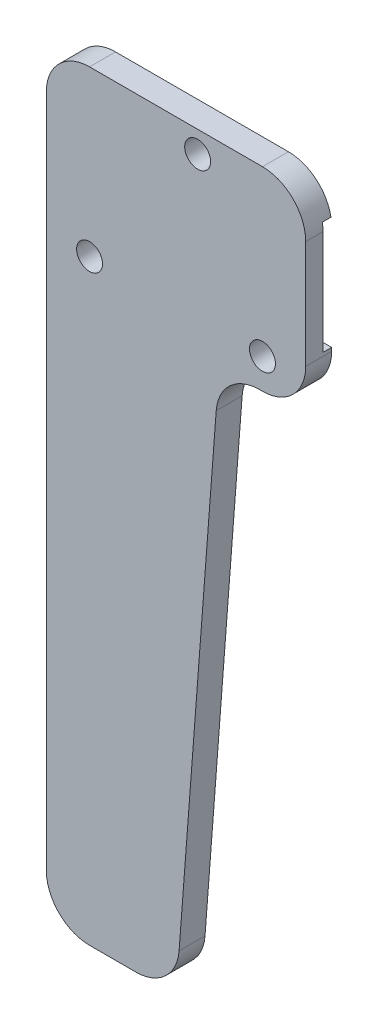
ISO-10303-21;
HEADER;
FILE_DESCRIPTION(('STEP AP214'),'2;1');
FILE_NAME('part.step','',(''),(''),'','','');
FILE_SCHEMA(('AUTOMOTIVE_DESIGN { 1 0 10303 214 1 1 1 1 }'));
ENDSEC;
DATA;
#1=APPLICATION_CONTEXT('core data for automotive mechanical design processes');
#2=APPLICATION_PROTOCOL_DEFINITION('international standard','automotive_design',2000,#1);
#3=PRODUCT_CONTEXT('',#1,'mechanical');
#4=PRODUCT('Part','Part','',(#3));
#5=PRODUCT_RELATED_PRODUCT_CATEGORY('part','',(#4));
#6=PRODUCT_DEFINITION_FORMATION('','',#4);
#7=PRODUCT_DEFINITION_CONTEXT('part definition',#1,'design');
#8=PRODUCT_DEFINITION('design','',#6,#7);
#9=PRODUCT_DEFINITION_SHAPE('','',#8);
#10=(LENGTH_UNIT() NAMED_UNIT(*) SI_UNIT(.MILLI.,.METRE.));
#11=(NAMED_UNIT(*) PLANE_ANGLE_UNIT() SI_UNIT($,.RADIAN.));
#12=(NAMED_UNIT(*) SI_UNIT($,.STERADIAN.) SOLID_ANGLE_UNIT());
#13=UNCERTAINTY_MEASURE_WITH_UNIT(LENGTH_MEASURE(1.E-05),#10,'distance_accuracy_value','');
#14=(GEOMETRIC_REPRESENTATION_CONTEXT(3) GLOBAL_UNCERTAINTY_ASSIGNED_CONTEXT((#13)) GLOBAL_UNIT_ASSIGNED_CONTEXT((#10,
#11,#12)) REPRESENTATION_CONTEXT('',''));
#15=CARTESIAN_POINT('',(0.,0.,0.));
#16=DIRECTION('',(0.,0.,1.));
#17=DIRECTION('',(1.,0.,0.));
#18=AXIS2_PLACEMENT_3D('',#15,#16,#17);
#19=CARTESIAN_POINT('',(5.00000000000001,-83.,-3.));
#20=DIRECTION('',(0.,0.,1.));
#21=DIRECTION('',(1.,0.,0.));
#22=AXIS2_PLACEMENT_3D('',#19,#20,#21);
#23=PLANE('',#22);
#24=CARTESIAN_POINT('',(17.5,-2.5,-3.));
#25=DIRECTION('',(0.,0.,1.));
#26=DIRECTION('',(1.,0.,0.));
#27=AXIS2_PLACEMENT_3D('',#24,#25,#26);
#28=CIRCLE('',#27,1.5);
#29=CARTESIAN_POINT('',(19.,-2.5,-3.));
#30=VERTEX_POINT('',#29);
#31=EDGE_CURVE('E186',#30,#30,#28,.T.);
#32=ORIENTED_EDGE('',*,*,#31,.T.);
#33=EDGE_LOOP('',(#32));
#34=FACE_BOUND('',#33,.T.);
#35=CARTESIAN_POINT('',(25.,-5.,-3.));
#36=DIRECTION('',(0.,0.,1.));
#37=DIRECTION('',(-1.,0.,0.));
#38=AXIS2_PLACEMENT_3D('',#35,#36,#37);
#39=CIRCLE('',#38,5.);
#40=CARTESIAN_POINT('',(29.9183330509432,-4.1,-3.));
#41=VERTEX_POINT('',#40);
#42=CARTESIAN_POINT('',(25.,0.,-3.));
#43=VERTEX_POINT('',#42);
#44=EDGE_CURVE('E144',#41,#43,#39,.T.);
#45=ORIENTED_EDGE('',*,*,#44,.F.);
#46=DIRECTION('',(-1.,0.,0.));
#47=VECTOR('',#46,1.);
#48=CARTESIAN_POINT('',(5.00000000000001,-4.09999999999999,-3.));
#49=LINE('',#48,#47);
#50=CARTESIAN_POINT('',(0.0816669490568273,-4.1,-3.));
#51=VERTEX_POINT('',#50);
#52=EDGE_CURVE('E11',#41,#51,#49,.T.);
#53=ORIENTED_EDGE('',*,*,#52,.T.);
#54=CARTESIAN_POINT('',(5.,-5.,-3.));
#55=DIRECTION('',(0.,0.,1.));
#56=DIRECTION('',(-1.,0.,0.));
#57=AXIS2_PLACEMENT_3D('',#54,#55,#56);
#58=CIRCLE('',#57,5.);
#59=CARTESIAN_POINT('',(5.00000000000004,0.,-3.));
#60=VERTEX_POINT('',#59);
#61=EDGE_CURVE('E172',#60,#51,#58,.T.);
#62=ORIENTED_EDGE('',*,*,#61,.F.);
#63=DIRECTION('',(-1.,0.,0.));
#64=VECTOR('',#63,1.);
#65=CARTESIAN_POINT('',(5.00000000000004,0.,-3.));
#66=LINE('',#65,#64);
#67=EDGE_CURVE('E157',#43,#60,#66,.T.);
#68=ORIENTED_EDGE('',*,*,#67,.F.);
#69=EDGE_LOOP('',(#45,#53,#62,#68));
#70=FACE_BOUND('',#69,.T.);
#71=ADVANCED_FACE('F44',(#34,#70),#23,.F.);
#72=CARTESIAN_POINT('',(5.00000000000001,-83.,-3.));
#73=DIRECTION('',(0.,0.,1.));
#74=DIRECTION('',(1.,0.,0.));
#75=AXIS2_PLACEMENT_3D('',#72,#73,#74);
#76=CYLINDRICAL_SURFACE('',#75,5.);
#77=CARTESIAN_POINT('',(5.00000000000001,-83.,0.));
#78=DIRECTION('',(0.,0.,1.));
#79=DIRECTION('',(1.,0.,0.));
#80=AXIS2_PLACEMENT_3D('',#77,#78,#79);
#81=CIRCLE('',#80,5.);
#82=CARTESIAN_POINT('',(0.,-83.,0.));
#83=VERTEX_POINT('',#82);
#84=CARTESIAN_POINT('',(5.00000000000005,-88.,0.));
#85=VERTEX_POINT('',#84);
#86=EDGE_CURVE('E181',#83,#85,#81,.T.);
#87=ORIENTED_EDGE('',*,*,#86,.F.);
#88=DIRECTION('',(0.,0.,1.));
#89=VECTOR('',#88,1.);
#90=CARTESIAN_POINT('',(0.,-83.,-3.));
#91=LINE('',#90,#89);
#92=CARTESIAN_POINT('',(0.,-83.,-3.));
#93=VERTEX_POINT('',#92);
#94=EDGE_CURVE('E53',#93,#83,#91,.T.);
#95=ORIENTED_EDGE('',*,*,#94,.F.);
#96=CARTESIAN_POINT('',(5.00000000000001,-83.,-3.));
#97=DIRECTION('',(0.,0.,1.));
#98=DIRECTION('',(1.,0.,0.));
#99=AXIS2_PLACEMENT_3D('',#96,#97,#98);
#100=CIRCLE('',#99,5.);
#101=CARTESIAN_POINT('',(5.00000000000005,-88.,-3.));
#102=VERTEX_POINT('',#101);
#103=EDGE_CURVE('E227',#93,#102,#100,.T.);
#104=ORIENTED_EDGE('',*,*,#103,.T.);
#105=DIRECTION('',(0.,0.,1.));
#106=VECTOR('',#105,1.);
#107=CARTESIAN_POINT('',(5.00000000000005,-88.,-3.));
#108=LINE('',#107,#106);
#109=EDGE_CURVE('E119',#102,#85,#108,.T.);
#110=ORIENTED_EDGE('',*,*,#109,.T.);
#111=EDGE_LOOP('',(#87,#95,#104,#110));
#112=FACE_BOUND('',#111,.T.);
#113=ADVANCED_FACE('F46',(#112),#76,.T.);
#114=CARTESIAN_POINT('',(0.,-5.00000000000004,-3.));
#115=DIRECTION('',(-1.,0.,0.));
#116=DIRECTION('',(0.,-1.,0.));
#117=AXIS2_PLACEMENT_3D('',#114,#115,#116);
#118=PLANE('',#117);
#119=DIRECTION('',(0.,0.,-1.));
#120=VECTOR('',#119,1.);
#121=CARTESIAN_POINT('',(0.,-17.1,-2.));
#122=LINE('',#121,#120);
#123=CARTESIAN_POINT('',(0.,-17.1,-2.));
#124=VERTEX_POINT('',#123);
#125=CARTESIAN_POINT('',(0.,-17.1,-3.));
#126=VERTEX_POINT('',#125);
#127=EDGE_CURVE('E389',#124,#126,#122,.T.);
#128=ORIENTED_EDGE('',*,*,#127,.T.);
#129=DIRECTION('',(0.,-1.,0.));
#130=VECTOR('',#129,1.);
#131=CARTESIAN_POINT('',(0.,-5.00000000000004,-3.));
#132=LINE('',#131,#130);
#133=EDGE_CURVE('E69',#126,#93,#132,.T.);
#134=ORIENTED_EDGE('',*,*,#133,.T.);
#135=ORIENTED_EDGE('',*,*,#94,.T.);
#136=DIRECTION('',(0.,-1.,0.));
#137=VECTOR('',#136,1.);
#138=CARTESIAN_POINT('',(0.,-5.00000000000004,0.));
#139=LINE('',#138,#137);
#140=CARTESIAN_POINT('',(0.,-5.00000000000004,0.));
#141=VERTEX_POINT('',#140);
#142=EDGE_CURVE('E223',#141,#83,#139,.T.);
#143=ORIENTED_EDGE('',*,*,#142,.F.);
#144=DIRECTION('',(0.,0.,1.));
#145=VECTOR('',#144,1.);
#146=CARTESIAN_POINT('',(0.,-5.00000000000004,-3.));
#147=LINE('',#146,#145);
#148=CARTESIAN_POINT('',(0.,-5.,-2.));
#149=VERTEX_POINT('',#148);
#150=EDGE_CURVE('E230',#149,#141,#147,.T.);
#151=ORIENTED_EDGE('',*,*,#150,.F.);
#152=DIRECTION('',(0.,1.,0.));
#153=VECTOR('',#152,1.);
#154=CARTESIAN_POINT('',(0.,-17.1,-2.));
#155=LINE('',#154,#153);
#156=EDGE_CURVE('E269',#124,#149,#155,.T.);
#157=ORIENTED_EDGE('',*,*,#156,.F.);
#158=EDGE_LOOP('',(#128,#134,#135,#143,#151,#157));
#159=FACE_BOUND('',#158,.T.);
#160=ADVANCED_FACE('F264',(#159),#118,.T.);
#161=CARTESIAN_POINT('',(5.,-5.,-3.));
#162=DIRECTION('',(0.,0.,1.));
#163=DIRECTION('',(1.,0.,0.));
#164=AXIS2_PLACEMENT_3D('',#161,#162,#163);
#165=CYLINDRICAL_SURFACE('',#164,5.);
#166=DIRECTION('',(0.,0.,1.));
#167=VECTOR('',#166,1.);
#168=CARTESIAN_POINT('',(0.0816669490568264,-4.1,-3.));
#169=LINE('',#168,#167);
#170=CARTESIAN_POINT('',(0.0816669490568264,-4.1,-2.));
#171=VERTEX_POINT('',#170);
#172=EDGE_CURVE('E280',#171,#51,#169,.F.);
#173=ORIENTED_EDGE('',*,*,#172,.F.);
#174=CARTESIAN_POINT('',(5.,-5.,-2.));
#175=DIRECTION('',(0.,0.,1.));
#176=DIRECTION('',(1.,0.,0.));
#177=AXIS2_PLACEMENT_3D('',#174,#175,#176);
#178=CIRCLE('',#177,5.);
#179=EDGE_CURVE('E277',#149,#171,#178,.F.);
#180=ORIENTED_EDGE('',*,*,#179,.F.);
#181=ORIENTED_EDGE('',*,*,#150,.T.);
#182=CARTESIAN_POINT('',(5.,-5.,0.));
#183=DIRECTION('',(0.,0.,1.));
#184=DIRECTION('',(-1.,0.,0.));
#185=AXIS2_PLACEMENT_3D('',#182,#183,#184);
#186=CIRCLE('',#185,5.);
#187=CARTESIAN_POINT('',(5.00000000000004,0.,0.));
#188=VERTEX_POINT('',#187);
#189=EDGE_CURVE('E219',#188,#141,#186,.T.);
#190=ORIENTED_EDGE('',*,*,#189,.F.);
#191=DIRECTION('',(0.,0.,1.));
#192=VECTOR('',#191,1.);
#193=CARTESIAN_POINT('',(5.00000000000004,0.,-3.));
#194=LINE('',#193,#192);
#195=EDGE_CURVE('E167',#60,#188,#194,.T.);
#196=ORIENTED_EDGE('',*,*,#195,.F.);
#197=ORIENTED_EDGE('',*,*,#61,.T.);
#198=EDGE_LOOP('',(#173,#180,#181,#190,#196,#197));
#199=FACE_BOUND('',#198,.T.);
#200=ADVANCED_FACE('F275',(#199),#165,.T.);
#201=CARTESIAN_POINT('',(5.00000000000004,0.,-3.));
#202=DIRECTION('',(0.,1.,0.));
#203=DIRECTION('',(0.,0.,1.));
#204=AXIS2_PLACEMENT_3D('',#201,#202,#203);
#205=PLANE('',#204);
#206=DIRECTION('',(-1.,0.,0.));
#207=VECTOR('',#206,1.);
#208=CARTESIAN_POINT('',(5.00000000000004,0.,0.));
#209=LINE('',#208,#207);
#210=CARTESIAN_POINT('',(25.,0.,0.));
#211=VERTEX_POINT('',#210);
#212=EDGE_CURVE('E164',#211,#188,#209,.T.);
#213=ORIENTED_EDGE('',*,*,#212,.F.);
#214=DIRECTION('',(0.,0.,1.));
#215=VECTOR('',#214,1.);
#216=CARTESIAN_POINT('',(25.,0.,-3.));
#217=LINE('',#216,#215);
#218=EDGE_CURVE('E148',#43,#211,#217,.T.);
#219=ORIENTED_EDGE('',*,*,#218,.F.);
#220=ORIENTED_EDGE('',*,*,#67,.T.);
#221=ORIENTED_EDGE('',*,*,#195,.T.);
#222=EDGE_LOOP('',(#213,#219,#220,#221));
#223=FACE_BOUND('',#222,.T.);
#224=ADVANCED_FACE('F162',(#223),#205,.T.);
#225=CARTESIAN_POINT('',(25.,-5.,-3.));
#226=DIRECTION('',(0.,0.,1.));
#227=DIRECTION('',(1.,0.,0.));
#228=AXIS2_PLACEMENT_3D('',#225,#226,#227);
#229=CYLINDRICAL_SURFACE('',#228,5.);
#230=DIRECTION('',(0.,0.,1.));
#231=VECTOR('',#230,1.);
#232=CARTESIAN_POINT('',(29.9183330509432,-4.1,-3.));
#233=LINE('',#232,#231);
#234=CARTESIAN_POINT('',(29.9183330509432,-4.1,-2.));
#235=VERTEX_POINT('',#234);
#236=EDGE_CURVE('E153',#41,#235,#233,.T.);
#237=ORIENTED_EDGE('',*,*,#236,.F.);
#238=ORIENTED_EDGE('',*,*,#44,.T.);
#239=ORIENTED_EDGE('',*,*,#218,.T.);
#240=CARTESIAN_POINT('',(25.,-5.,0.));
#241=DIRECTION('',(0.,0.,1.));
#242=DIRECTION('',(-1.,0.,0.));
#243=AXIS2_PLACEMENT_3D('',#240,#241,#242);
#244=CIRCLE('',#243,5.);
#245=CARTESIAN_POINT('',(30.,-5.00000000000003,0.));
#246=VERTEX_POINT('',#245);
#247=EDGE_CURVE('E214',#246,#211,#244,.T.);
#248=ORIENTED_EDGE('',*,*,#247,.F.);
#249=DIRECTION('',(0.,0.,1.));
#250=VECTOR('',#249,1.);
#251=CARTESIAN_POINT('',(30.,-5.00000000000003,-3.));
#252=LINE('',#251,#250);
#253=CARTESIAN_POINT('',(30.,-5.00000000000003,-2.));
#254=VERTEX_POINT('',#253);
#255=EDGE_CURVE('E168',#254,#246,#252,.T.);
#256=ORIENTED_EDGE('',*,*,#255,.F.);
#257=CARTESIAN_POINT('',(25.,-5.,-2.));
#258=DIRECTION('',(0.,0.,1.));
#259=DIRECTION('',(1.,0.,0.));
#260=AXIS2_PLACEMENT_3D('',#257,#258,#259);
#261=CIRCLE('',#260,5.);
#262=EDGE_CURVE('E286',#235,#254,#261,.F.);
#263=ORIENTED_EDGE('',*,*,#262,.F.);
#264=EDGE_LOOP('',(#237,#238,#239,#248,#256,#263));
#265=FACE_BOUND('',#264,.T.);
#266=ADVANCED_FACE('F146',(#265),#229,.T.);
#267=CARTESIAN_POINT('',(30.,-5.00000000000004,-3.));
#268=DIRECTION('',(1.,0.,0.));
#269=DIRECTION('',(0.,0.,-1.));
#270=AXIS2_PLACEMENT_3D('',#267,#268,#269);
#271=PLANE('',#270);
#272=DIRECTION('',(0.,0.,-1.));
#273=VECTOR('',#272,1.);
#274=CARTESIAN_POINT('',(30.,-17.1,-2.));
#275=LINE('',#274,#273);
#276=CARTESIAN_POINT('',(30.,-17.1,-2.));
#277=VERTEX_POINT('',#276);
#278=CARTESIAN_POINT('',(30.,-17.1,-3.));
#279=VERTEX_POINT('',#278);
#280=EDGE_CURVE('E60',#277,#279,#275,.T.);
#281=ORIENTED_EDGE('',*,*,#280,.F.);
#282=DIRECTION('',(0.,-1.,0.));
#283=VECTOR('',#282,1.);
#284=CARTESIAN_POINT('',(30.,-17.1,-2.));
#285=LINE('',#284,#283);
#286=EDGE_CURVE('E371',#254,#277,#285,.T.);
#287=ORIENTED_EDGE('',*,*,#286,.F.);
#288=ORIENTED_EDGE('',*,*,#255,.T.);
#289=DIRECTION('',(0.,1.,0.));
#290=VECTOR('',#289,1.);
#291=CARTESIAN_POINT('',(30.,-5.00000000000004,0.));
#292=LINE('',#291,#290);
#293=CARTESIAN_POINT('',(30.,-17.5,0.));
#294=VERTEX_POINT('',#293);
#295=EDGE_CURVE('E210',#294,#246,#292,.T.);
#296=ORIENTED_EDGE('',*,*,#295,.F.);
#297=DIRECTION('',(0.,0.,1.));
#298=VECTOR('',#297,1.);
#299=CARTESIAN_POINT('',(30.,-17.5,-3.));
#300=LINE('',#299,#298);
#301=CARTESIAN_POINT('',(30.,-17.5,-3.));
#302=VERTEX_POINT('',#301);
#303=EDGE_CURVE('E237',#302,#294,#300,.T.);
#304=ORIENTED_EDGE('',*,*,#303,.F.);
#305=DIRECTION('',(0.,1.,0.));
#306=VECTOR('',#305,1.);
#307=CARTESIAN_POINT('',(30.,-5.00000000000004,-3.));
#308=LINE('',#307,#306);
#309=EDGE_CURVE('E158',#302,#279,#308,.T.);
#310=ORIENTED_EDGE('',*,*,#309,.T.);
#311=EDGE_LOOP('',(#281,#287,#288,#296,#304,#310));
#312=FACE_BOUND('',#311,.T.);
#313=ADVANCED_FACE('F343',(#312),#271,.T.);
#314=CARTESIAN_POINT('',(25.,-17.5,-3.));
#315=DIRECTION('',(0.,0.,1.));
#316=DIRECTION('',(1.,0.,0.));
#317=AXIS2_PLACEMENT_3D('',#314,#315,#316);
#318=CYLINDRICAL_SURFACE('',#317,5.);
#319=CARTESIAN_POINT('',(25.,-17.5,0.));
#320=DIRECTION('',(0.,0.,1.));
#321=DIRECTION('',(-1.,0.,0.));
#322=AXIS2_PLACEMENT_3D('',#319,#320,#321);
#323=CIRCLE('',#322,5.);
#324=CARTESIAN_POINT('',(25.,-22.5,0.));
#325=VERTEX_POINT('',#324);
#326=EDGE_CURVE('E206',#325,#294,#323,.T.);
#327=ORIENTED_EDGE('',*,*,#326,.F.);
#328=DIRECTION('',(0.,0.,1.));
#329=VECTOR('',#328,1.);
#330=CARTESIAN_POINT('',(25.,-22.5,-3.));
#331=LINE('',#330,#329);
#332=CARTESIAN_POINT('',(25.,-22.5,-3.));
#333=VERTEX_POINT('',#332);
#334=EDGE_CURVE('E240',#333,#325,#331,.T.);
#335=ORIENTED_EDGE('',*,*,#334,.F.);
#336=CARTESIAN_POINT('',(25.,-17.5,-3.));
#337=DIRECTION('',(0.,0.,1.));
#338=DIRECTION('',(-1.,0.,0.));
#339=AXIS2_PLACEMENT_3D('',#336,#337,#338);
#340=CIRCLE('',#339,5.);
#341=EDGE_CURVE('E336',#333,#302,#340,.T.);
#342=ORIENTED_EDGE('',*,*,#341,.T.);
#343=ORIENTED_EDGE('',*,*,#303,.T.);
#344=EDGE_LOOP('',(#327,#335,#342,#343));
#345=FACE_BOUND('',#344,.T.);
#346=ADVANCED_FACE('F354',(#345),#318,.T.);
#347=CARTESIAN_POINT('',(25.,-22.5,-3.));
#348=DIRECTION('',(0.,-1.,0.));
#349=DIRECTION('',(0.,0.,-1.));
#350=AXIS2_PLACEMENT_3D('',#347,#348,#349);
#351=PLANE('',#350);
#352=DIRECTION('',(1.,0.,0.));
#353=VECTOR('',#352,1.);
#354=CARTESIAN_POINT('',(25.,-22.5,0.));
#355=LINE('',#354,#353);
#356=CARTESIAN_POINT('',(24.6328673655021,-22.5,0.));
#357=VERTEX_POINT('',#356);
#358=EDGE_CURVE('E202',#357,#325,#355,.T.);
#359=ORIENTED_EDGE('',*,*,#358,.F.);
#360=DIRECTION('',(0.,0.,1.));
#361=VECTOR('',#360,1.);
#362=CARTESIAN_POINT('',(24.6328673655021,-22.5,-3.));
#363=LINE('',#362,#361);
#364=CARTESIAN_POINT('',(24.6328673655021,-22.5,-3.));
#365=VERTEX_POINT('',#364);
#366=EDGE_CURVE('E243',#365,#357,#363,.T.);
#367=ORIENTED_EDGE('',*,*,#366,.F.);
#368=DIRECTION('',(1.,0.,0.));
#369=VECTOR('',#368,1.);
#370=CARTESIAN_POINT('',(25.,-22.5,-3.));
#371=LINE('',#370,#369);
#372=EDGE_CURVE('E332',#365,#333,#371,.T.);
#373=ORIENTED_EDGE('',*,*,#372,.T.);
#374=ORIENTED_EDGE('',*,*,#334,.T.);
#375=EDGE_LOOP('',(#359,#367,#373,#374));
#376=FACE_BOUND('',#375,.T.);
#377=ADVANCED_FACE('F357',(#376),#351,.T.);
#378=CARTESIAN_POINT('',(24.6328673655021,-27.5,-3.));
#379=DIRECTION('',(0.,0.,1.));
#380=DIRECTION('',(1.,0.,0.));
#381=AXIS2_PLACEMENT_3D('',#378,#379,#380);
#382=CYLINDRICAL_SURFACE('',#381,5.);
#383=CARTESIAN_POINT('',(24.6328673655021,-27.5,0.));
#384=DIRECTION('',(0.,0.,-1.));
#385=DIRECTION('',(1.,0.,0.));
#386=AXIS2_PLACEMENT_3D('',#383,#384,#385);
#387=CIRCLE('',#386,5.);
#388=CARTESIAN_POINT('',(19.6473719214733,-27.1194278287001,0.));
#389=VERTEX_POINT('',#388);
#390=EDGE_CURVE('E198',#389,#357,#387,.T.);
#391=ORIENTED_EDGE('',*,*,#390,.F.);
#392=DIRECTION('',(0.,0.,1.));
#393=VECTOR('',#392,1.);
#394=CARTESIAN_POINT('',(19.6473719214733,-27.1194278287001,-3.));
#395=LINE('',#394,#393);
#396=CARTESIAN_POINT('',(19.6473719214733,-27.1194278287001,-3.));
#397=VERTEX_POINT('',#396);
#398=EDGE_CURVE('E246',#397,#389,#395,.T.);
#399=ORIENTED_EDGE('',*,*,#398,.F.);
#400=CARTESIAN_POINT('',(24.6328673655021,-27.5,-3.));
#401=DIRECTION('',(0.,0.,-1.));
#402=DIRECTION('',(1.,0.,0.));
#403=AXIS2_PLACEMENT_3D('',#400,#401,#402);
#404=CIRCLE('',#403,5.);
#405=EDGE_CURVE('E328',#397,#365,#404,.T.);
#406=ORIENTED_EDGE('',*,*,#405,.T.);
#407=ORIENTED_EDGE('',*,*,#366,.T.);
#408=EDGE_LOOP('',(#391,#399,#406,#407));
#409=FACE_BOUND('',#408,.T.);
#410=ADVANCED_FACE('F362',(#409),#382,.F.);
#411=CARTESIAN_POINT('',(19.6473719214733,-27.1194278287001,-3.));
#412=DIRECTION('',(0.997099088805763,-0.0761144342599819,0.));
#413=DIRECTION('',(0.0761144342599819,0.997099088805763,0.));
#414=AXIS2_PLACEMENT_3D('',#411,#412,#413);
#415=PLANE('',#414);
#416=DIRECTION('',(0.0761144342599819,0.997099088805763,0.));
#417=VECTOR('',#416,1.);
#418=CARTESIAN_POINT('',(19.6473719214733,-27.1194278287001,0.));
#419=LINE('',#418,#417);
#420=CARTESIAN_POINT('',(15.3526280785267,-83.3805721712999,0.));
#421=VERTEX_POINT('',#420);
#422=EDGE_CURVE('E194',#421,#389,#419,.T.);
#423=ORIENTED_EDGE('',*,*,#422,.F.);
#424=DIRECTION('',(0.,0.,1.));
#425=VECTOR('',#424,1.);
#426=CARTESIAN_POINT('',(15.3526280785267,-83.3805721712999,-3.));
#427=LINE('',#426,#425);
#428=CARTESIAN_POINT('',(15.3526280785267,-83.3805721712999,-3.));
#429=VERTEX_POINT('',#428);
#430=EDGE_CURVE('E249',#429,#421,#427,.T.);
#431=ORIENTED_EDGE('',*,*,#430,.F.);
#432=DIRECTION('',(0.0761144342599819,0.997099088805763,0.));
#433=VECTOR('',#432,1.);
#434=CARTESIAN_POINT('',(19.6473719214733,-27.1194278287001,-3.));
#435=LINE('',#434,#433);
#436=EDGE_CURVE('E324',#429,#397,#435,.T.);
#437=ORIENTED_EDGE('',*,*,#436,.T.);
#438=ORIENTED_EDGE('',*,*,#398,.T.);
#439=EDGE_LOOP('',(#423,#431,#437,#438));
#440=FACE_BOUND('',#439,.T.);
#441=ADVANCED_FACE('F365',(#440),#415,.T.);
#442=CARTESIAN_POINT('',(10.3671326344979,-83.,-3.));
#443=DIRECTION('',(0.,0.,1.));
#444=DIRECTION('',(1.,0.,0.));
#445=AXIS2_PLACEMENT_3D('',#442,#443,#444);
#446=CYLINDRICAL_SURFACE('',#445,5.);
#447=CARTESIAN_POINT('',(10.3671326344979,-83.,0.));
#448=DIRECTION('',(0.,0.,1.));
#449=DIRECTION('',(-1.,0.,0.));
#450=AXIS2_PLACEMENT_3D('',#447,#448,#449);
#451=CIRCLE('',#450,5.);
#452=CARTESIAN_POINT('',(10.3671326344979,-88.,0.));
#453=VERTEX_POINT('',#452);
#454=EDGE_CURVE('E190',#453,#421,#451,.T.);
#455=ORIENTED_EDGE('',*,*,#454,.F.);
#456=DIRECTION('',(0.,0.,1.));
#457=VECTOR('',#456,1.);
#458=CARTESIAN_POINT('',(10.3671326344979,-88.,-3.));
#459=LINE('',#458,#457);
#460=CARTESIAN_POINT('',(10.3671326344979,-88.,-3.));
#461=VERTEX_POINT('',#460);
#462=EDGE_CURVE('E252',#461,#453,#459,.T.);
#463=ORIENTED_EDGE('',*,*,#462,.F.);
#464=CARTESIAN_POINT('',(10.3671326344979,-83.,-3.));
#465=DIRECTION('',(0.,0.,1.));
#466=DIRECTION('',(-1.,0.,0.));
#467=AXIS2_PLACEMENT_3D('',#464,#465,#466);
#468=CIRCLE('',#467,5.);
#469=EDGE_CURVE('E320',#461,#429,#468,.T.);
#470=ORIENTED_EDGE('',*,*,#469,.T.);
#471=ORIENTED_EDGE('',*,*,#430,.T.);
#472=EDGE_LOOP('',(#455,#463,#470,#471));
#473=FACE_BOUND('',#472,.T.);
#474=ADVANCED_FACE('F368',(#473),#446,.T.);
#475=CARTESIAN_POINT('',(10.3671326344979,-88.,-3.));
#476=DIRECTION('',(0.,-1.,0.));
#477=DIRECTION('',(0.,0.,-1.));
#478=AXIS2_PLACEMENT_3D('',#475,#476,#477);
#479=PLANE('',#478);
#480=DIRECTION('',(1.,0.,0.));
#481=VECTOR('',#480,1.);
#482=CARTESIAN_POINT('',(10.3671326344979,-88.,0.));
#483=LINE('',#482,#481);
#484=EDGE_CURVE('E185',#85,#453,#483,.T.);
#485=ORIENTED_EDGE('',*,*,#484,.F.);
#486=ORIENTED_EDGE('',*,*,#109,.F.);
#487=DIRECTION('',(1.,0.,0.));
#488=VECTOR('',#487,1.);
#489=CARTESIAN_POINT('',(10.3671326344979,-88.,-3.));
#490=LINE('',#489,#488);
#491=EDGE_CURVE('E317',#102,#461,#490,.T.);
#492=ORIENTED_EDGE('',*,*,#491,.T.);
#493=ORIENTED_EDGE('',*,*,#462,.T.);
#494=EDGE_LOOP('',(#485,#486,#492,#493));
#495=FACE_BOUND('',#494,.T.);
#496=ADVANCED_FACE('F258',(#495),#479,.T.);
#497=CARTESIAN_POINT('',(25.,-19.,-3.));
#498=DIRECTION('',(0.,0.,1.));
#499=DIRECTION('',(1.,0.,0.));
#500=AXIS2_PLACEMENT_3D('',#497,#498,#499);
#501=CIRCLE('',#500,1.5);
#502=CARTESIAN_POINT('',(26.5,-19.,-3.));
#503=VERTEX_POINT('',#502);
#504=EDGE_CURVE('E291',#503,#503,#501,.T.);
#505=ORIENTED_EDGE('',*,*,#504,.T.);
#506=EDGE_LOOP('',(#505));
#507=FACE_BOUND('',#506,.T.);
#508=CARTESIAN_POINT('',(5.,-19.,-3.));
#509=DIRECTION('',(0.,0.,1.));
#510=DIRECTION('',(1.,0.,0.));
#511=AXIS2_PLACEMENT_3D('',#508,#509,#510);
#512=CIRCLE('',#511,1.5);
#513=CARTESIAN_POINT('',(6.5,-19.,-3.));
#514=VERTEX_POINT('',#513);
#515=EDGE_CURVE('E301',#514,#514,#512,.T.);
#516=ORIENTED_EDGE('',*,*,#515,.T.);
#517=EDGE_LOOP('',(#516));
#518=FACE_BOUND('',#517,.T.);
#519=ORIENTED_EDGE('',*,*,#133,.F.);
#520=DIRECTION('',(-1.,0.,0.));
#521=VECTOR('',#520,1.);
#522=CARTESIAN_POINT('',(30.,-17.1,-3.));
#523=LINE('',#522,#521);
#524=EDGE_CURVE('E351',#279,#126,#523,.T.);
#525=ORIENTED_EDGE('',*,*,#524,.F.);
#526=ORIENTED_EDGE('',*,*,#309,.F.);
#527=ORIENTED_EDGE('',*,*,#341,.F.);
#528=ORIENTED_EDGE('',*,*,#372,.F.);
#529=ORIENTED_EDGE('',*,*,#405,.F.);
#530=ORIENTED_EDGE('',*,*,#436,.F.);
#531=ORIENTED_EDGE('',*,*,#469,.F.);
#532=ORIENTED_EDGE('',*,*,#491,.F.);
#533=ORIENTED_EDGE('',*,*,#103,.F.);
#534=EDGE_LOOP('',(#519,#525,#526,#527,#528,#529,#530,#531,#532,#533));
#535=FACE_BOUND('',#534,.T.);
#536=ADVANCED_FACE('F349',(#507,#518,#535),#23,.F.);
#537=CARTESIAN_POINT('',(5.00000000000001,-83.,0.));
#538=DIRECTION('',(0.,0.,1.));
#539=DIRECTION('',(1.,0.,0.));
#540=AXIS2_PLACEMENT_3D('',#537,#538,#539);
#541=PLANE('',#540);
#542=CARTESIAN_POINT('',(25.,-19.,0.));
#543=DIRECTION('',(0.,0.,1.));
#544=DIRECTION('',(1.,0.,0.));
#545=AXIS2_PLACEMENT_3D('',#542,#543,#544);
#546=CIRCLE('',#545,1.5);
#547=CARTESIAN_POINT('',(26.5,-19.,0.));
#548=VERTEX_POINT('',#547);
#549=EDGE_CURVE('E285',#548,#548,#546,.T.);
#550=ORIENTED_EDGE('',*,*,#549,.F.);
#551=EDGE_LOOP('',(#550));
#552=FACE_BOUND('',#551,.T.);
#553=CARTESIAN_POINT('',(5.,-19.,0.));
#554=DIRECTION('',(0.,0.,1.));
#555=DIRECTION('',(1.,0.,0.));
#556=AXIS2_PLACEMENT_3D('',#553,#554,#555);
#557=CIRCLE('',#556,1.5);
#558=CARTESIAN_POINT('',(6.5,-19.,0.));
#559=VERTEX_POINT('',#558);
#560=EDGE_CURVE('E299',#559,#559,#557,.T.);
#561=ORIENTED_EDGE('',*,*,#560,.F.);
#562=EDGE_LOOP('',(#561));
#563=FACE_BOUND('',#562,.T.);
#564=CARTESIAN_POINT('',(17.5,-2.5,0.));
#565=DIRECTION('',(0.,0.,1.));
#566=DIRECTION('',(1.,0.,0.));
#567=AXIS2_PLACEMENT_3D('',#564,#565,#566);
#568=CIRCLE('',#567,1.5);
#569=CARTESIAN_POINT('',(19.,-2.5,0.));
#570=VERTEX_POINT('',#569);
#571=EDGE_CURVE('E305',#570,#570,#568,.T.);
#572=ORIENTED_EDGE('',*,*,#571,.F.);
#573=EDGE_LOOP('',(#572));
#574=FACE_BOUND('',#573,.T.);
#575=ORIENTED_EDGE('',*,*,#86,.T.);
#576=ORIENTED_EDGE('',*,*,#484,.T.);
#577=ORIENTED_EDGE('',*,*,#454,.T.);
#578=ORIENTED_EDGE('',*,*,#422,.T.);
#579=ORIENTED_EDGE('',*,*,#390,.T.);
#580=ORIENTED_EDGE('',*,*,#358,.T.);
#581=ORIENTED_EDGE('',*,*,#326,.T.);
#582=ORIENTED_EDGE('',*,*,#295,.T.);
#583=ORIENTED_EDGE('',*,*,#247,.T.);
#584=ORIENTED_EDGE('',*,*,#212,.T.);
#585=ORIENTED_EDGE('',*,*,#189,.T.);
#586=ORIENTED_EDGE('',*,*,#142,.T.);
#587=EDGE_LOOP('',(#575,#576,#577,#578,#579,#580,#581,#582,#583,#584,#585,#586));
#588=FACE_BOUND('',#587,.T.);
#589=ADVANCED_FACE('F261',(#552,#563,#574,#588),#541,.T.);
#590=CARTESIAN_POINT('',(17.5,-2.5,-3.));
#591=DIRECTION('',(0.,0.,1.));
#592=DIRECTION('',(1.,0.,0.));
#593=AXIS2_PLACEMENT_3D('',#590,#591,#592);
#594=CYLINDRICAL_SURFACE('',#593,1.5);
#595=ORIENTED_EDGE('',*,*,#31,.F.);
#596=EDGE_LOOP('',(#595));
#597=FACE_BOUND('',#596,.T.);
#598=ORIENTED_EDGE('',*,*,#571,.T.);
#599=EDGE_LOOP('',(#598));
#600=FACE_BOUND('',#599,.T.);
#601=ADVANCED_FACE('F434',(#597,#600),#594,.F.);
#602=CARTESIAN_POINT('',(5.,-19.,-3.));
#603=DIRECTION('',(0.,0.,1.));
#604=DIRECTION('',(1.,0.,0.));
#605=AXIS2_PLACEMENT_3D('',#602,#603,#604);
#606=CYLINDRICAL_SURFACE('',#605,1.5);
#607=ORIENTED_EDGE('',*,*,#515,.F.);
#608=EDGE_LOOP('',(#607));
#609=FACE_BOUND('',#608,.T.);
#610=ORIENTED_EDGE('',*,*,#560,.T.);
#611=EDGE_LOOP('',(#610));
#612=FACE_BOUND('',#611,.T.);
#613=ADVANCED_FACE('F416',(#609,#612),#606,.F.);
#614=CARTESIAN_POINT('',(25.,-19.,-3.));
#615=DIRECTION('',(0.,0.,1.));
#616=DIRECTION('',(1.,0.,0.));
#617=AXIS2_PLACEMENT_3D('',#614,#615,#616);
#618=CYLINDRICAL_SURFACE('',#617,1.5);
#619=ORIENTED_EDGE('',*,*,#504,.F.);
#620=EDGE_LOOP('',(#619));
#621=FACE_BOUND('',#620,.T.);
#622=ORIENTED_EDGE('',*,*,#549,.T.);
#623=EDGE_LOOP('',(#622));
#624=FACE_BOUND('',#623,.T.);
#625=ADVANCED_FACE('F408',(#621,#624),#618,.F.);
#626=CARTESIAN_POINT('',(30.,-4.1,-2.));
#627=DIRECTION('',(0.,1.,0.));
#628=DIRECTION('',(0.,0.,1.));
#629=AXIS2_PLACEMENT_3D('',#626,#627,#628);
#630=PLANE('',#629);
#631=ORIENTED_EDGE('',*,*,#172,.T.);
#632=ORIENTED_EDGE('',*,*,#52,.F.);
#633=ORIENTED_EDGE('',*,*,#236,.T.);
#634=DIRECTION('',(1.,0.,0.));
#635=VECTOR('',#634,1.);
#636=CARTESIAN_POINT('',(30.,-4.1,-2.));
#637=LINE('',#636,#635);
#638=EDGE_CURVE('E393',#171,#235,#637,.T.);
#639=ORIENTED_EDGE('',*,*,#638,.F.);
#640=EDGE_LOOP('',(#631,#632,#633,#639));
#641=FACE_BOUND('',#640,.T.);
#642=ADVANCED_FACE('F406',(#641),#630,.F.);
#643=CARTESIAN_POINT('',(30.,-17.1,-2.));
#644=DIRECTION('',(0.,-1.,0.));
#645=DIRECTION('',(0.,0.,-1.));
#646=AXIS2_PLACEMENT_3D('',#643,#644,#645);
#647=PLANE('',#646);
#648=ORIENTED_EDGE('',*,*,#524,.T.);
#649=ORIENTED_EDGE('',*,*,#127,.F.);
#650=DIRECTION('',(-1.,0.,0.));
#651=VECTOR('',#650,1.);
#652=CARTESIAN_POINT('',(30.,-17.1,-2.));
#653=LINE('',#652,#651);
#654=EDGE_CURVE('E385',#277,#124,#653,.T.);
#655=ORIENTED_EDGE('',*,*,#654,.F.);
#656=ORIENTED_EDGE('',*,*,#280,.T.);
#657=EDGE_LOOP('',(#648,#649,#655,#656));
#658=FACE_BOUND('',#657,.T.);
#659=ADVANCED_FACE('F388',(#658),#647,.F.);
#660=CARTESIAN_POINT('',(0.,0.,-2.));
#661=DIRECTION('',(0.,0.,1.));
#662=DIRECTION('',(1.,0.,0.));
#663=AXIS2_PLACEMENT_3D('',#660,#661,#662);
#664=PLANE('',#663);
#665=ORIENTED_EDGE('',*,*,#179,.T.);
#666=ORIENTED_EDGE('',*,*,#638,.T.);
#667=ORIENTED_EDGE('',*,*,#262,.T.);
#668=ORIENTED_EDGE('',*,*,#286,.T.);
#669=ORIENTED_EDGE('',*,*,#654,.T.);
#670=ORIENTED_EDGE('',*,*,#156,.T.);
#671=EDGE_LOOP('',(#665,#666,#667,#668,#669,#670));
#672=FACE_BOUND('',#671,.T.);
#673=ADVANCED_FACE('F384',(#672),#664,.F.);
#674=CLOSED_SHELL('',(#71,#113,#160,#200,#224,#266,#313,#346,#377,#410,#441,#474,#496,#536,#589,
#601,#613,#625,#642,#659,#673));
#675=MANIFOLD_SOLID_BREP('B2',#674);
#676=ADVANCED_BREP_SHAPE_REPRESENTATION('',(#18,#675),#14);
#677=SHAPE_DEFINITION_REPRESENTATION(#9,#676);
ENDSEC;
END-ISO-10303-21;
